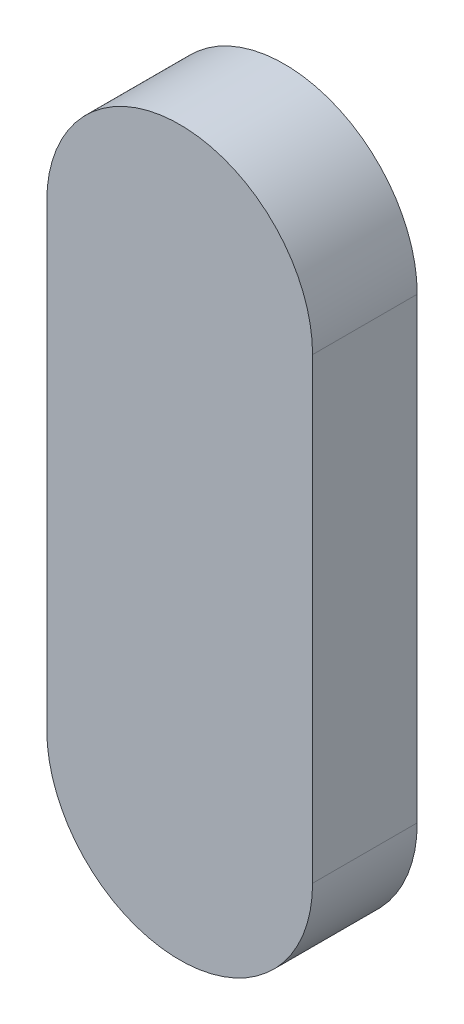
ISO-10303-21;
HEADER;
FILE_DESCRIPTION(('STEP AP214'),'2;1');
FILE_NAME('part.step','',(''),(''),'','','');
FILE_SCHEMA(('AUTOMOTIVE_DESIGN { 1 0 10303 214 1 1 1 1 }'));
ENDSEC;
DATA;
#1=APPLICATION_CONTEXT('core data for automotive mechanical design processes');
#2=APPLICATION_PROTOCOL_DEFINITION('international standard','automotive_design',2000,#1);
#3=PRODUCT_CONTEXT('',#1,'mechanical');
#4=PRODUCT('Part','Part','',(#3));
#5=PRODUCT_RELATED_PRODUCT_CATEGORY('part','',(#4));
#6=PRODUCT_DEFINITION_FORMATION('','',#4);
#7=PRODUCT_DEFINITION_CONTEXT('part definition',#1,'design');
#8=PRODUCT_DEFINITION('design','',#6,#7);
#9=PRODUCT_DEFINITION_SHAPE('','',#8);
#10=(LENGTH_UNIT() NAMED_UNIT(*) SI_UNIT(.MILLI.,.METRE.));
#11=(NAMED_UNIT(*) PLANE_ANGLE_UNIT() SI_UNIT($,.RADIAN.));
#12=(NAMED_UNIT(*) SI_UNIT($,.STERADIAN.) SOLID_ANGLE_UNIT());
#13=UNCERTAINTY_MEASURE_WITH_UNIT(LENGTH_MEASURE(1.E-05),#10,'distance_accuracy_value','');
#14=(GEOMETRIC_REPRESENTATION_CONTEXT(3) GLOBAL_UNCERTAINTY_ASSIGNED_CONTEXT((#13)) GLOBAL_UNIT_ASSIGNED_CONTEXT((#10,
#11,#12)) REPRESENTATION_CONTEXT('',''));
#15=CARTESIAN_POINT('',(0.,0.,0.));
#16=DIRECTION('',(0.,0.,1.));
#17=DIRECTION('',(1.,0.,0.));
#18=AXIS2_PLACEMENT_3D('',#15,#16,#17);
#19=CARTESIAN_POINT('',(150.5712,88.7078236,0.));
#20=DIRECTION('',(-1.,0.,0.));
#21=DIRECTION('',(0.,1.,0.));
#22=AXIS2_PLACEMENT_3D('',#19,#20,#21);
#23=PLANE('',#22);
#24=DIRECTION('',(0.,1.,0.));
#25=VECTOR('',#24,1.);
#26=CARTESIAN_POINT('',(150.5712,88.7078236,0.1999996));
#27=LINE('',#26,#25);
#28=CARTESIAN_POINT('',(150.5712,88.7078236,0.1999996));
#29=VERTEX_POINT('',#28);
#30=CARTESIAN_POINT('',(150.5712,89.5828028,0.1999996));
#31=VERTEX_POINT('',#30);
#32=EDGE_CURVE('E11',#29,#31,#27,.T.);
#33=ORIENTED_EDGE('',*,*,#32,.F.);
#34=DIRECTION('',(0.,0.,1.));
#35=VECTOR('',#34,1.);
#36=CARTESIAN_POINT('',(150.5712,88.7078236,0.));
#37=LINE('',#36,#35);
#38=CARTESIAN_POINT('',(150.5712,88.7078236,0.));
#39=VERTEX_POINT('',#38);
#40=EDGE_CURVE('E24',#39,#29,#37,.T.);
#41=ORIENTED_EDGE('',*,*,#40,.F.);
#42=DIRECTION('',(0.,1.,0.));
#43=VECTOR('',#42,1.);
#44=CARTESIAN_POINT('',(150.5712,88.7078236,0.));
#45=LINE('',#44,#43);
#46=CARTESIAN_POINT('',(150.5712,89.5828028,0.));
#47=VERTEX_POINT('',#46);
#48=EDGE_CURVE('E75',#39,#47,#45,.T.);
#49=ORIENTED_EDGE('',*,*,#48,.T.);
#50=DIRECTION('',(0.,0.,1.));
#51=VECTOR('',#50,1.);
#52=CARTESIAN_POINT('',(150.5712,89.5828028,0.));
#53=LINE('',#52,#51);
#54=EDGE_CURVE('E37',#47,#31,#53,.T.);
#55=ORIENTED_EDGE('',*,*,#54,.T.);
#56=EDGE_LOOP('',(#33,#41,#49,#55));
#57=FACE_BOUND('',#56,.T.);
#58=ADVANCED_FACE('F17',(#57),#23,.F.);
#59=CARTESIAN_POINT('',(150.3172,89.5828028,0.));
#60=DIRECTION('',(0.,0.,-1.));
#61=DIRECTION('',(1.,1.11896493820492E-13,0.));
#62=AXIS2_PLACEMENT_3D('',#59,#60,#61);
#63=CYLINDRICAL_SURFACE('',#62,0.25400000000001);
#64=CARTESIAN_POINT('',(150.3172,89.5828028,0.1999996));
#65=DIRECTION('',(0.,0.,1.));
#66=DIRECTION('',(1.,1.11896493820492E-13,0.));
#67=AXIS2_PLACEMENT_3D('',#64,#65,#66);
#68=CIRCLE('',#67,0.25400000000001);
#69=CARTESIAN_POINT('',(150.0632,89.5828028,0.1999996));
#70=VERTEX_POINT('',#69);
#71=EDGE_CURVE('E83',#31,#70,#68,.T.);
#72=ORIENTED_EDGE('',*,*,#71,.F.);
#73=ORIENTED_EDGE('',*,*,#54,.F.);
#74=CARTESIAN_POINT('',(150.3172,89.5828028,0.));
#75=DIRECTION('',(0.,0.,1.));
#76=DIRECTION('',(1.,1.11896493820492E-13,0.));
#77=AXIS2_PLACEMENT_3D('',#74,#75,#76);
#78=CIRCLE('',#77,0.25400000000001);
#79=CARTESIAN_POINT('',(150.0632,89.5828028,0.));
#80=VERTEX_POINT('',#79);
#81=EDGE_CURVE('E81',#47,#80,#78,.T.);
#82=ORIENTED_EDGE('',*,*,#81,.T.);
#83=DIRECTION('',(0.,0.,1.));
#84=VECTOR('',#83,1.);
#85=CARTESIAN_POINT('',(150.0632,89.5828028,0.));
#86=LINE('',#85,#84);
#87=EDGE_CURVE('E67',#80,#70,#86,.T.);
#88=ORIENTED_EDGE('',*,*,#87,.T.);
#89=EDGE_LOOP('',(#72,#73,#82,#88));
#90=FACE_BOUND('',#89,.T.);
#91=ADVANCED_FACE('F89',(#90),#63,.T.);
#92=CARTESIAN_POINT('',(150.0632,89.5828028,0.));
#93=DIRECTION('',(1.,0.,0.));
#94=DIRECTION('',(0.,-1.,0.));
#95=AXIS2_PLACEMENT_3D('',#92,#93,#94);
#96=PLANE('',#95);
#97=DIRECTION('',(0.,-1.,0.));
#98=VECTOR('',#97,1.);
#99=CARTESIAN_POINT('',(150.0632,89.5828028,0.1999996));
#100=LINE('',#99,#98);
#101=CARTESIAN_POINT('',(150.0632,88.7078236,0.1999996));
#102=VERTEX_POINT('',#101);
#103=EDGE_CURVE('E71',#70,#102,#100,.T.);
#104=ORIENTED_EDGE('',*,*,#103,.F.);
#105=ORIENTED_EDGE('',*,*,#87,.F.);
#106=DIRECTION('',(0.,-1.,0.));
#107=VECTOR('',#106,1.);
#108=CARTESIAN_POINT('',(150.0632,89.5828028,0.));
#109=LINE('',#108,#107);
#110=CARTESIAN_POINT('',(150.0632,88.7078236,0.));
#111=VERTEX_POINT('',#110);
#112=EDGE_CURVE('E63',#80,#111,#109,.T.);
#113=ORIENTED_EDGE('',*,*,#112,.T.);
#114=DIRECTION('',(0.,0.,1.));
#115=VECTOR('',#114,1.);
#116=CARTESIAN_POINT('',(150.0632,88.7078236,0.));
#117=LINE('',#116,#115);
#118=EDGE_CURVE('E53',#111,#102,#117,.T.);
#119=ORIENTED_EDGE('',*,*,#118,.T.);
#120=EDGE_LOOP('',(#104,#105,#113,#119));
#121=FACE_BOUND('',#120,.T.);
#122=ADVANCED_FACE('F66',(#121),#96,.F.);
#123=CARTESIAN_POINT('',(150.3172,88.7078236,0.));
#124=DIRECTION('',(0.,0.,-1.));
#125=DIRECTION('',(-1.,0.,0.));
#126=AXIS2_PLACEMENT_3D('',#123,#124,#125);
#127=CYLINDRICAL_SURFACE('',#126,0.25400000000001);
#128=CARTESIAN_POINT('',(150.3172,88.7078236,0.1999996));
#129=DIRECTION('',(0.,0.,1.));
#130=DIRECTION('',(-1.,0.,0.));
#131=AXIS2_PLACEMENT_3D('',#128,#129,#130);
#132=CIRCLE('',#131,0.25400000000001);
#133=EDGE_CURVE('E59',#102,#29,#132,.T.);
#134=ORIENTED_EDGE('',*,*,#133,.F.);
#135=ORIENTED_EDGE('',*,*,#118,.F.);
#136=CARTESIAN_POINT('',(150.3172,88.7078236,0.));
#137=DIRECTION('',(0.,0.,1.));
#138=DIRECTION('',(-1.,0.,0.));
#139=AXIS2_PLACEMENT_3D('',#136,#137,#138);
#140=CIRCLE('',#139,0.25400000000001);
#141=EDGE_CURVE('E57',#111,#39,#140,.T.);
#142=ORIENTED_EDGE('',*,*,#141,.T.);
#143=ORIENTED_EDGE('',*,*,#40,.T.);
#144=EDGE_LOOP('',(#134,#135,#142,#143));
#145=FACE_BOUND('',#144,.T.);
#146=ADVANCED_FACE('F55',(#145),#127,.T.);
#147=CARTESIAN_POINT('',(150.5712,88.7078236,0.));
#148=DIRECTION('',(0.,0.,-1.));
#149=DIRECTION('',(-1.,0.,0.));
#150=AXIS2_PLACEMENT_3D('',#147,#148,#149);
#151=PLANE('',#150);
#152=ORIENTED_EDGE('',*,*,#141,.F.);
#153=ORIENTED_EDGE('',*,*,#112,.F.);
#154=ORIENTED_EDGE('',*,*,#81,.F.);
#155=ORIENTED_EDGE('',*,*,#48,.F.);
#156=EDGE_LOOP('',(#152,#153,#154,#155));
#157=FACE_BOUND('',#156,.T.);
#158=ADVANCED_FACE('F74',(#157),#151,.T.);
#159=CARTESIAN_POINT('',(150.5712,88.7078236,0.1999996));
#160=DIRECTION('',(0.,0.,-1.));
#161=DIRECTION('',(-1.,0.,0.));
#162=AXIS2_PLACEMENT_3D('',#159,#160,#161);
#163=PLANE('',#162);
#164=ORIENTED_EDGE('',*,*,#32,.T.);
#165=ORIENTED_EDGE('',*,*,#71,.T.);
#166=ORIENTED_EDGE('',*,*,#103,.T.);
#167=ORIENTED_EDGE('',*,*,#133,.T.);
#168=EDGE_LOOP('',(#164,#165,#166,#167));
#169=FACE_BOUND('',#168,.T.);
#170=ADVANCED_FACE('F91',(#169),#163,.F.);
#171=CLOSED_SHELL('',(#58,#91,#122,#146,#158,#170));
#172=MANIFOLD_SOLID_BREP('B1',#171);
#173=ADVANCED_BREP_SHAPE_REPRESENTATION('',(#18,#172),#14);
#174=SHAPE_DEFINITION_REPRESENTATION(#9,#173);
ENDSEC;
END-ISO-10303-21;
